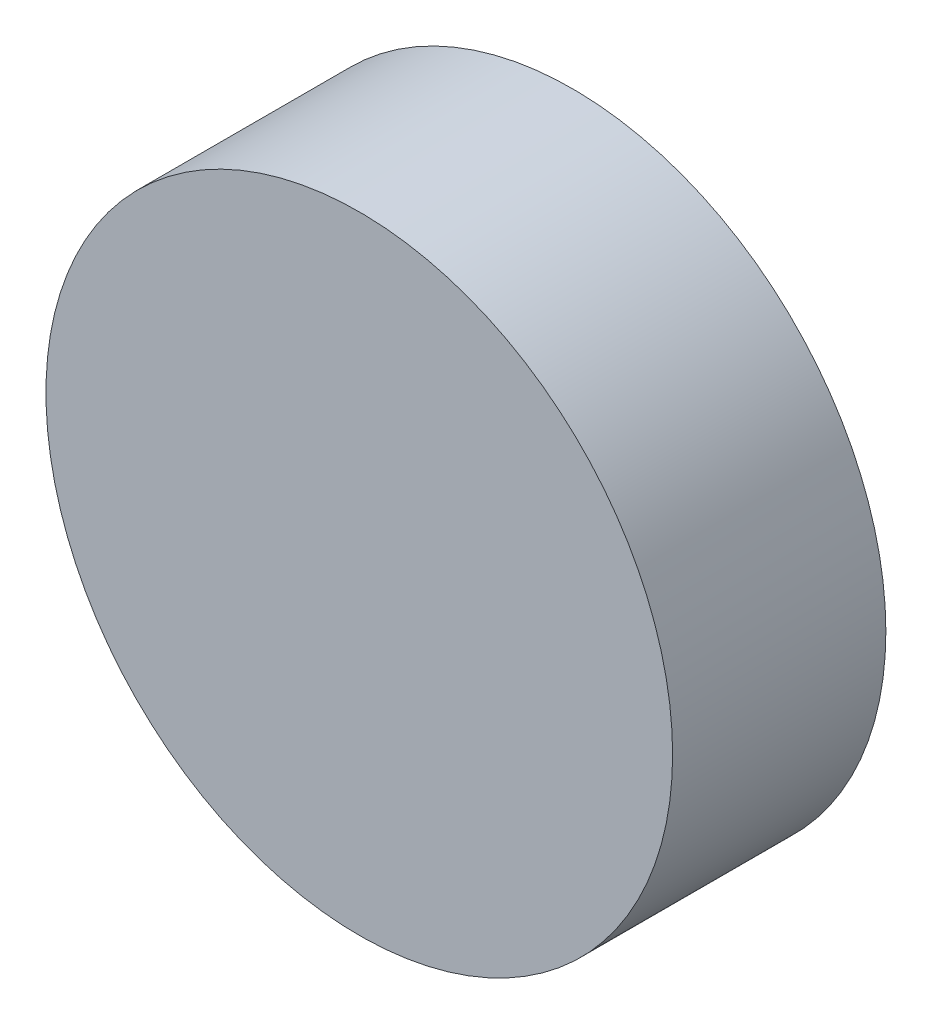
ISO-10303-21;
HEADER;
FILE_DESCRIPTION(('STEP AP214'),'2;1');
FILE_NAME('part.step','',(''),(''),'','','');
FILE_SCHEMA(('AUTOMOTIVE_DESIGN { 1 0 10303 214 1 1 1 1 }'));
ENDSEC;
DATA;
#1=APPLICATION_CONTEXT('core data for automotive mechanical design processes');
#2=APPLICATION_PROTOCOL_DEFINITION('international standard','automotive_design',2000,#1);
#3=PRODUCT_CONTEXT('',#1,'mechanical');
#4=PRODUCT('Part','Part','',(#3));
#5=PRODUCT_RELATED_PRODUCT_CATEGORY('part','',(#4));
#6=PRODUCT_DEFINITION_FORMATION('','',#4);
#7=PRODUCT_DEFINITION_CONTEXT('part definition',#1,'design');
#8=PRODUCT_DEFINITION('design','',#6,#7);
#9=PRODUCT_DEFINITION_SHAPE('','',#8);
#10=(LENGTH_UNIT() NAMED_UNIT(*) SI_UNIT(.MILLI.,.METRE.));
#11=(NAMED_UNIT(*) PLANE_ANGLE_UNIT() SI_UNIT($,.RADIAN.));
#12=(NAMED_UNIT(*) SI_UNIT($,.STERADIAN.) SOLID_ANGLE_UNIT());
#13=UNCERTAINTY_MEASURE_WITH_UNIT(LENGTH_MEASURE(1.E-05),#10,'distance_accuracy_value','');
#14=(GEOMETRIC_REPRESENTATION_CONTEXT(3) GLOBAL_UNCERTAINTY_ASSIGNED_CONTEXT((#13)) GLOBAL_UNIT_ASSIGNED_CONTEXT((#10,
#11,#12)) REPRESENTATION_CONTEXT('',''));
#15=CARTESIAN_POINT('',(0.,0.,0.));
#16=DIRECTION('',(0.,0.,1.));
#17=DIRECTION('',(1.,0.,0.));
#18=AXIS2_PLACEMENT_3D('',#15,#16,#17);
#19=CARTESIAN_POINT('',(-3.719,5.173,11.731));
#20=DIRECTION('',(0.,0.,-1.));
#21=DIRECTION('',(-1.,0.,0.));
#22=AXIS2_PLACEMENT_3D('',#19,#20,#21);
#23=CYLINDRICAL_SURFACE('',#22,17.237);
#24=CARTESIAN_POINT('',(-3.719,5.173,11.731));
#25=DIRECTION('',(0.,0.,1.));
#26=DIRECTION('',(1.,0.,0.));
#27=AXIS2_PLACEMENT_3D('',#24,#25,#26);
#28=CIRCLE('',#27,17.237);
#29=CARTESIAN_POINT('',(13.518,5.173,11.731));
#30=VERTEX_POINT('',#29);
#31=EDGE_CURVE('E10',#30,#30,#28,.T.);
#32=ORIENTED_EDGE('',*,*,#31,.F.);
#33=EDGE_LOOP('',(#32));
#34=FACE_BOUND('',#33,.T.);
#35=CARTESIAN_POINT('',(-3.719,5.173,0.));
#36=DIRECTION('',(0.,0.,1.));
#37=DIRECTION('',(1.,0.,0.));
#38=AXIS2_PLACEMENT_3D('',#35,#36,#37);
#39=CIRCLE('',#38,17.237);
#40=CARTESIAN_POINT('',(13.518,5.173,0.));
#41=VERTEX_POINT('',#40);
#42=EDGE_CURVE('E45',#41,#41,#39,.T.);
#43=ORIENTED_EDGE('',*,*,#42,.T.);
#44=EDGE_LOOP('',(#43));
#45=FACE_BOUND('',#44,.T.);
#46=ADVANCED_FACE('F39',(#34,#45),#23,.T.);
#47=CARTESIAN_POINT('',(-3.719,5.173,11.731));
#48=DIRECTION('',(0.,0.,1.));
#49=DIRECTION('',(1.,0.,0.));
#50=AXIS2_PLACEMENT_3D('',#47,#48,#49);
#51=PLANE('',#50);
#52=ORIENTED_EDGE('',*,*,#31,.T.);
#53=EDGE_LOOP('',(#52));
#54=FACE_BOUND('',#53,.T.);
#55=ADVANCED_FACE('F53',(#54),#51,.T.);
#56=CARTESIAN_POINT('',(-3.719,5.173,0.));
#57=DIRECTION('',(0.,0.,1.));
#58=DIRECTION('',(1.,0.,0.));
#59=AXIS2_PLACEMENT_3D('',#56,#57,#58);
#60=PLANE('',#59);
#61=ORIENTED_EDGE('',*,*,#42,.F.);
#62=EDGE_LOOP('',(#61));
#63=FACE_BOUND('',#62,.T.);
#64=ADVANCED_FACE('F55',(#63),#60,.F.);
#65=CLOSED_SHELL('',(#46,#55,#64));
#66=MANIFOLD_SOLID_BREP('B2',#65);
#67=ADVANCED_BREP_SHAPE_REPRESENTATION('',(#18,#66),#14);
#68=SHAPE_DEFINITION_REPRESENTATION(#9,#67);
ENDSEC;
END-ISO-10303-21;
